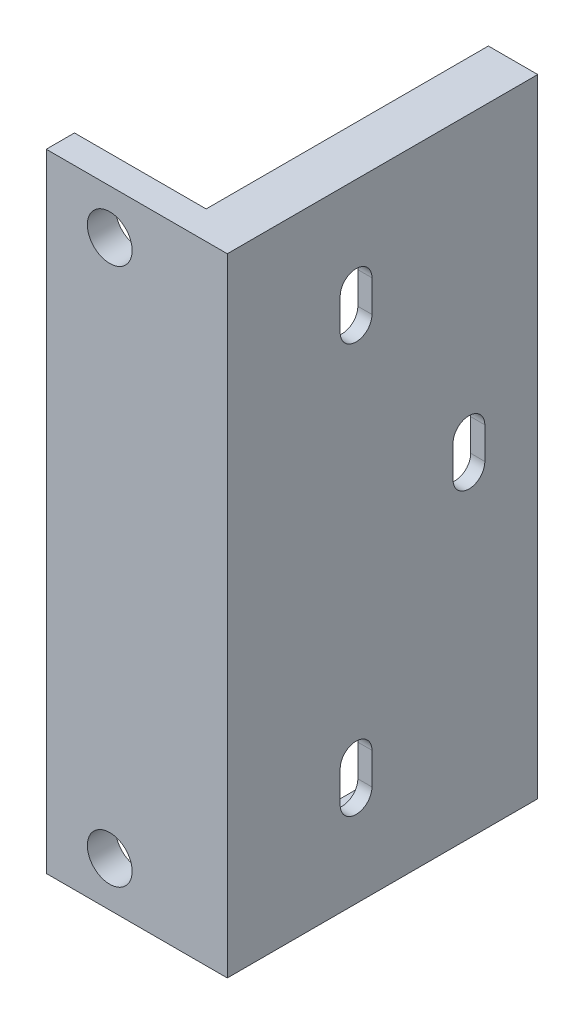
ISO-10303-21;
HEADER;
FILE_DESCRIPTION(('STEP AP214'),'2;1');
FILE_NAME('part.step','',(''),(''),'','','');
FILE_SCHEMA(('AUTOMOTIVE_DESIGN { 1 0 10303 214 1 1 1 1 }'));
ENDSEC;
DATA;
#1=APPLICATION_CONTEXT('core data for automotive mechanical design processes');
#2=APPLICATION_PROTOCOL_DEFINITION('international standard','automotive_design',2000,#1);
#3=PRODUCT_CONTEXT('',#1,'mechanical');
#4=PRODUCT('Part','Part','',(#3));
#5=PRODUCT_RELATED_PRODUCT_CATEGORY('part','',(#4));
#6=PRODUCT_DEFINITION_FORMATION('','',#4);
#7=PRODUCT_DEFINITION_CONTEXT('part definition',#1,'design');
#8=PRODUCT_DEFINITION('design','',#6,#7);
#9=PRODUCT_DEFINITION_SHAPE('','',#8);
#10=(LENGTH_UNIT() NAMED_UNIT(*) SI_UNIT(.MILLI.,.METRE.));
#11=(NAMED_UNIT(*) PLANE_ANGLE_UNIT() SI_UNIT($,.RADIAN.));
#12=(NAMED_UNIT(*) SI_UNIT($,.STERADIAN.) SOLID_ANGLE_UNIT());
#13=UNCERTAINTY_MEASURE_WITH_UNIT(LENGTH_MEASURE(1.E-05),#10,'distance_accuracy_value','');
#14=(GEOMETRIC_REPRESENTATION_CONTEXT(3) GLOBAL_UNCERTAINTY_ASSIGNED_CONTEXT((#13)) GLOBAL_UNIT_ASSIGNED_CONTEXT((#10,
#11,#12)) REPRESENTATION_CONTEXT('',''));
#15=CARTESIAN_POINT('',(0.,0.,0.));
#16=DIRECTION('',(0.,0.,1.));
#17=DIRECTION('',(1.,0.,0.));
#18=AXIS2_PLACEMENT_3D('',#15,#16,#17);
#19=CARTESIAN_POINT('',(0.,0.,-2.));
#20=DIRECTION('',(0.,0.,1.));
#21=DIRECTION('',(1.,0.,0.));
#22=AXIS2_PLACEMENT_3D('',#19,#20,#21);
#23=PLANE('',#22);
#24=CARTESIAN_POINT('',(0.,38.1,-2.));
#25=DIRECTION('',(0.,0.,1.));
#26=DIRECTION('',(1.,0.,0.));
#27=AXIS2_PLACEMENT_3D('',#24,#25,#26);
#28=CIRCLE('',#27,3.175);
#29=CARTESIAN_POINT('',(3.17500000000001,38.1,-2.));
#30=VERTEX_POINT('',#29);
#31=EDGE_CURVE('E525',#30,#30,#28,.F.);
#32=ORIENTED_EDGE('',*,*,#31,.F.);
#33=EDGE_LOOP('',(#32));
#34=FACE_BOUND('',#33,.T.);
#35=CARTESIAN_POINT('',(0.,-38.1,-2.));
#36=DIRECTION('',(0.,0.,1.));
#37=DIRECTION('',(1.,0.,0.));
#38=AXIS2_PLACEMENT_3D('',#35,#36,#37);
#39=CIRCLE('',#38,3.175);
#40=CARTESIAN_POINT('',(3.17500000000001,-38.1,-2.));
#41=VERTEX_POINT('',#40);
#42=EDGE_CURVE('E522',#41,#41,#39,.T.);
#43=ORIENTED_EDGE('',*,*,#42,.T.);
#44=EDGE_LOOP('',(#43));
#45=FACE_BOUND('',#44,.T.);
#46=DIRECTION('',(1.,0.,0.));
#47=VECTOR('',#46,1.);
#48=CARTESIAN_POINT('',(9.66240000000001,37.45,-1.99999999999997));
#49=LINE('',#48,#47);
#50=CARTESIAN_POINT('',(9.66240000000001,37.45,-1.99999999999997));
#51=VERTEX_POINT('',#50);
#52=CARTESIAN_POINT('',(14.6624,37.45,-1.99999999999997));
#53=VERTEX_POINT('',#52);
#54=EDGE_CURVE('E324',#51,#53,#49,.T.);
#55=ORIENTED_EDGE('',*,*,#54,.T.);
#56=DIRECTION('',(0.,1.,0.));
#57=VECTOR('',#56,1.);
#58=CARTESIAN_POINT('',(14.6624,44.45,-2.));
#59=LINE('',#58,#57);
#60=CARTESIAN_POINT('',(14.6624,18.,-2.));
#61=VERTEX_POINT('',#60);
#62=EDGE_CURVE('E441',#61,#53,#59,.T.);
#63=ORIENTED_EDGE('',*,*,#62,.F.);
#64=DIRECTION('',(1.,0.,0.));
#65=VECTOR('',#64,1.);
#66=CARTESIAN_POINT('',(9.6624,18.,-2.));
#67=LINE('',#66,#65);
#68=CARTESIAN_POINT('',(9.6624,18.,-2.));
#69=VERTEX_POINT('',#68);
#70=EDGE_CURVE('E364',#69,#61,#67,.T.);
#71=ORIENTED_EDGE('',*,*,#70,.F.);
#72=DIRECTION('',(0.,1.,0.));
#73=VECTOR('',#72,1.);
#74=CARTESIAN_POINT('',(9.6624,11.,-2.));
#75=LINE('',#74,#73);
#76=CARTESIAN_POINT('',(9.6624,11.,-2.));
#77=VERTEX_POINT('',#76);
#78=EDGE_CURVE('E380',#77,#69,#75,.T.);
#79=ORIENTED_EDGE('',*,*,#78,.F.);
#80=DIRECTION('',(1.,0.,0.));
#81=VECTOR('',#80,1.);
#82=CARTESIAN_POINT('',(9.6624,11.,-2.));
#83=LINE('',#82,#81);
#84=CARTESIAN_POINT('',(14.6624,11.,-2.));
#85=VERTEX_POINT('',#84);
#86=EDGE_CURVE('E361',#77,#85,#83,.T.);
#87=ORIENTED_EDGE('',*,*,#86,.T.);
#88=CARTESIAN_POINT('',(14.6624,-11.,-2.));
#89=VERTEX_POINT('',#88);
#90=EDGE_CURVE('E513',#89,#85,#59,.T.);
#91=ORIENTED_EDGE('',*,*,#90,.F.);
#92=DIRECTION('',(1.,0.,0.));
#93=VECTOR('',#92,1.);
#94=CARTESIAN_POINT('',(9.6624,-11.,-2.));
#95=LINE('',#94,#93);
#96=CARTESIAN_POINT('',(9.6624,-11.,-2.));
#97=VERTEX_POINT('',#96);
#98=EDGE_CURVE('E411',#97,#89,#95,.T.);
#99=ORIENTED_EDGE('',*,*,#98,.F.);
#100=DIRECTION('',(0.,1.,0.));
#101=VECTOR('',#100,1.);
#102=CARTESIAN_POINT('',(9.6624,-11.,-2.));
#103=LINE('',#102,#101);
#104=CARTESIAN_POINT('',(9.6624,-18.,-2.));
#105=VERTEX_POINT('',#104);
#106=EDGE_CURVE('E397',#105,#97,#103,.T.);
#107=ORIENTED_EDGE('',*,*,#106,.F.);
#108=DIRECTION('',(1.,0.,0.));
#109=VECTOR('',#108,1.);
#110=CARTESIAN_POINT('',(9.6624,-18.,-2.));
#111=LINE('',#110,#109);
#112=CARTESIAN_POINT('',(14.6624,-18.,-2.));
#113=VERTEX_POINT('',#112);
#114=EDGE_CURVE('E413',#105,#113,#111,.T.);
#115=ORIENTED_EDGE('',*,*,#114,.T.);
#116=CARTESIAN_POINT('',(14.6624,-37.45,-2.));
#117=VERTEX_POINT('',#116);
#118=EDGE_CURVE('E500',#117,#113,#59,.T.);
#119=ORIENTED_EDGE('',*,*,#118,.F.);
#120=DIRECTION('',(1.,0.,0.));
#121=VECTOR('',#120,1.);
#122=CARTESIAN_POINT('',(9.66239999999999,-37.45,-2.));
#123=LINE('',#122,#121);
#124=CARTESIAN_POINT('',(9.66239999999999,-37.45,-2.));
#125=VERTEX_POINT('',#124);
#126=EDGE_CURVE('E332',#125,#117,#123,.T.);
#127=ORIENTED_EDGE('',*,*,#126,.F.);
#128=DIRECTION('',(0.,1.,0.));
#129=VECTOR('',#128,1.);
#130=CARTESIAN_POINT('',(9.66239999999999,-44.45,-2.));
#131=LINE('',#130,#129);
#132=CARTESIAN_POINT('',(9.66239999999999,-44.45,-2.));
#133=VERTEX_POINT('',#132);
#134=EDGE_CURVE('E353',#133,#125,#131,.T.);
#135=ORIENTED_EDGE('',*,*,#134,.F.);
#136=DIRECTION('',(1.,0.,0.));
#137=VECTOR('',#136,1.);
#138=CARTESIAN_POINT('',(0.,-44.45,-2.));
#139=LINE('',#138,#137);
#140=CARTESIAN_POINT('',(-8.99999999999998,-44.45,-2.));
#141=VERTEX_POINT('',#140);
#142=EDGE_CURVE('E519',#141,#133,#139,.T.);
#143=ORIENTED_EDGE('',*,*,#142,.F.);
#144=DIRECTION('',(0.,-1.,0.));
#145=VECTOR('',#144,1.);
#146=CARTESIAN_POINT('',(-8.99999999999998,0.,-2.));
#147=LINE('',#146,#145);
#148=CARTESIAN_POINT('',(-8.99999999999999,44.45,-2.));
#149=VERTEX_POINT('',#148);
#150=EDGE_CURVE('E516',#149,#141,#147,.T.);
#151=ORIENTED_EDGE('',*,*,#150,.F.);
#152=DIRECTION('',(1.,0.,0.));
#153=VECTOR('',#152,1.);
#154=CARTESIAN_POINT('',(0.,44.45,-2.));
#155=LINE('',#154,#153);
#156=CARTESIAN_POINT('',(9.66240000000001,44.45,-1.99999999999997));
#157=VERTEX_POINT('',#156);
#158=EDGE_CURVE('E511',#149,#157,#155,.T.);
#159=ORIENTED_EDGE('',*,*,#158,.T.);
#160=DIRECTION('',(0.,1.,0.));
#161=VECTOR('',#160,1.);
#162=CARTESIAN_POINT('',(9.66240000000001,44.45,-1.99999999999997));
#163=LINE('',#162,#161);
#164=EDGE_CURVE('E337',#51,#157,#163,.T.);
#165=ORIENTED_EDGE('',*,*,#164,.F.);
#166=EDGE_LOOP('',(#55,#63,#71,#79,#87,#91,#99,#107,#115,#119,#127,#135,#143,#151,#159,#165));
#167=FACE_BOUND('',#166,.T.);
#168=ADVANCED_FACE('F53',(#34,#45,#167),#23,.F.);
#169=CARTESIAN_POINT('',(14.6624,44.45,-42.));
#170=DIRECTION('',(1.,0.,0.));
#171=DIRECTION('',(0.,1.,0.));
#172=AXIS2_PLACEMENT_3D('',#169,#170,#171);
#173=PLANE('',#172);
#174=DIRECTION('',(0.,-1.,0.));
#175=VECTOR('',#174,1.);
#176=CARTESIAN_POINT('',(14.6624,44.45,-14.));
#177=LINE('',#176,#175);
#178=CARTESIAN_POINT('',(14.6624,31.25,-14.));
#179=VERTEX_POINT('',#178);
#180=CARTESIAN_POINT('',(14.6624,26.75,-14.));
#181=VERTEX_POINT('',#180);
#182=EDGE_CURVE('E62',#179,#181,#177,.T.);
#183=ORIENTED_EDGE('',*,*,#182,.T.);
#184=CARTESIAN_POINT('',(14.6624,26.75,-16.25));
#185=DIRECTION('',(1.,0.,0.));
#186=DIRECTION('',(0.,1.,0.));
#187=AXIS2_PLACEMENT_3D('',#184,#185,#186);
#188=CIRCLE('',#187,2.25);
#189=CARTESIAN_POINT('',(14.6624,26.75,-18.5));
#190=VERTEX_POINT('',#189);
#191=EDGE_CURVE('E11',#181,#190,#188,.T.);
#192=ORIENTED_EDGE('',*,*,#191,.T.);
#193=DIRECTION('',(0.,1.,0.));
#194=VECTOR('',#193,1.);
#195=CARTESIAN_POINT('',(14.6624,44.45,-18.5));
#196=LINE('',#195,#194);
#197=CARTESIAN_POINT('',(14.6624,31.25,-18.5));
#198=VERTEX_POINT('',#197);
#199=EDGE_CURVE('E561',#190,#198,#196,.T.);
#200=ORIENTED_EDGE('',*,*,#199,.T.);
#201=CARTESIAN_POINT('',(14.6624,31.25,-16.25));
#202=DIRECTION('',(1.,0.,0.));
#203=DIRECTION('',(0.,1.,0.));
#204=AXIS2_PLACEMENT_3D('',#201,#202,#203);
#205=CIRCLE('',#204,2.25);
#206=EDGE_CURVE('E565',#198,#179,#205,.T.);
#207=ORIENTED_EDGE('',*,*,#206,.T.);
#208=EDGE_LOOP('',(#183,#192,#200,#207));
#209=FACE_BOUND('',#208,.T.);
#210=DIRECTION('',(0.,0.,1.));
#211=VECTOR('',#210,1.);
#212=CARTESIAN_POINT('',(14.6624,37.45,-42.));
#213=LINE('',#212,#211);
#214=CARTESIAN_POINT('',(14.6624,37.45,-42.));
#215=VERTEX_POINT('',#214);
#216=EDGE_CURVE('E329',#215,#53,#213,.T.);
#217=ORIENTED_EDGE('',*,*,#216,.F.);
#218=DIRECTION('',(0.,1.,0.));
#219=VECTOR('',#218,1.);
#220=CARTESIAN_POINT('',(14.6624,44.45,-42.));
#221=LINE('',#220,#219);
#222=CARTESIAN_POINT('',(14.6624,18.,-42.));
#223=VERTEX_POINT('',#222);
#224=EDGE_CURVE('E502',#223,#215,#221,.T.);
#225=ORIENTED_EDGE('',*,*,#224,.F.);
#226=DIRECTION('',(0.,0.,-1.));
#227=VECTOR('',#226,1.);
#228=CARTESIAN_POINT('',(14.6624,18.,-42.));
#229=LINE('',#228,#227);
#230=EDGE_CURVE('E370',#61,#223,#229,.T.);
#231=ORIENTED_EDGE('',*,*,#230,.F.);
#232=ORIENTED_EDGE('',*,*,#62,.T.);
#233=EDGE_LOOP('',(#217,#225,#231,#232));
#234=FACE_BOUND('',#233,.T.);
#235=ADVANCED_FACE('F571',(#209,#234),#173,.F.);
#236=DIRECTION('',(0.,1.,0.));
#237=VECTOR('',#236,1.);
#238=CARTESIAN_POINT('',(14.6624,44.45,-18.5));
#239=LINE('',#238,#237);
#240=CARTESIAN_POINT('',(14.6624,-31.25,-18.5));
#241=VERTEX_POINT('',#240);
#242=CARTESIAN_POINT('',(14.6624,-26.75,-18.5));
#243=VERTEX_POINT('',#242);
#244=EDGE_CURVE('E539',#241,#243,#239,.T.);
#245=ORIENTED_EDGE('',*,*,#244,.T.);
#246=CARTESIAN_POINT('',(14.6624,-26.75,-16.25));
#247=DIRECTION('',(1.,0.,0.));
#248=DIRECTION('',(0.,1.,0.));
#249=AXIS2_PLACEMENT_3D('',#246,#247,#248);
#250=CIRCLE('',#249,2.25);
#251=CARTESIAN_POINT('',(14.6624,-26.75,-14.));
#252=VERTEX_POINT('',#251);
#253=EDGE_CURVE('E542',#243,#252,#250,.T.);
#254=ORIENTED_EDGE('',*,*,#253,.T.);
#255=DIRECTION('',(0.,-1.,0.));
#256=VECTOR('',#255,1.);
#257=CARTESIAN_POINT('',(14.6624,44.45,-14.));
#258=LINE('',#257,#256);
#259=CARTESIAN_POINT('',(14.6624,-31.25,-14.));
#260=VERTEX_POINT('',#259);
#261=EDGE_CURVE('E295',#252,#260,#258,.T.);
#262=ORIENTED_EDGE('',*,*,#261,.T.);
#263=CARTESIAN_POINT('',(14.6624,-31.25,-16.25));
#264=DIRECTION('',(1.,0.,0.));
#265=DIRECTION('',(0.,1.,0.));
#266=AXIS2_PLACEMENT_3D('',#263,#264,#265);
#267=CIRCLE('',#266,2.25);
#268=EDGE_CURVE('E536',#260,#241,#267,.T.);
#269=ORIENTED_EDGE('',*,*,#268,.T.);
#270=EDGE_LOOP('',(#245,#254,#262,#269));
#271=FACE_BOUND('',#270,.T.);
#272=DIRECTION('',(0.,0.,-1.));
#273=VECTOR('',#272,1.);
#274=CARTESIAN_POINT('',(14.6624,-37.45,-42.));
#275=LINE('',#274,#273);
#276=CARTESIAN_POINT('',(14.6624,-37.45,-42.));
#277=VERTEX_POINT('',#276);
#278=EDGE_CURVE('E348',#117,#277,#275,.T.);
#279=ORIENTED_EDGE('',*,*,#278,.F.);
#280=ORIENTED_EDGE('',*,*,#118,.T.);
#281=DIRECTION('',(0.,0.,1.));
#282=VECTOR('',#281,1.);
#283=CARTESIAN_POINT('',(14.6624,-18.,-42.));
#284=LINE('',#283,#282);
#285=CARTESIAN_POINT('',(14.6624,-18.,-42.));
#286=VERTEX_POINT('',#285);
#287=EDGE_CURVE('E377',#286,#113,#284,.T.);
#288=ORIENTED_EDGE('',*,*,#287,.F.);
#289=EDGE_CURVE('E503',#277,#286,#221,.T.);
#290=ORIENTED_EDGE('',*,*,#289,.F.);
#291=EDGE_LOOP('',(#279,#280,#288,#290));
#292=FACE_BOUND('',#291,.T.);
#293=ADVANCED_FACE('F608',(#271,#292),#173,.F.);
#294=DIRECTION('',(0.,1.,0.));
#295=VECTOR('',#294,1.);
#296=CARTESIAN_POINT('',(14.6624,44.45,-34.5));
#297=LINE('',#296,#295);
#298=CARTESIAN_POINT('',(14.6624,0.699999999999994,-34.5));
#299=VERTEX_POINT('',#298);
#300=CARTESIAN_POINT('',(14.6624,5.2,-34.5));
#301=VERTEX_POINT('',#300);
#302=EDGE_CURVE('E553',#299,#301,#297,.T.);
#303=ORIENTED_EDGE('',*,*,#302,.T.);
#304=CARTESIAN_POINT('',(14.6624,5.2,-32.25));
#305=DIRECTION('',(1.,0.,0.));
#306=DIRECTION('',(0.,1.,0.));
#307=AXIS2_PLACEMENT_3D('',#304,#305,#306);
#308=CIRCLE('',#307,2.25);
#309=CARTESIAN_POINT('',(14.6624,5.19999999999998,-30.));
#310=VERTEX_POINT('',#309);
#311=EDGE_CURVE('E557',#301,#310,#308,.T.);
#312=ORIENTED_EDGE('',*,*,#311,.T.);
#313=DIRECTION('',(0.,-1.,0.));
#314=VECTOR('',#313,1.);
#315=CARTESIAN_POINT('',(14.6624,44.45,-30.));
#316=LINE('',#315,#314);
#317=CARTESIAN_POINT('',(14.6624,0.699999999999978,-30.));
#318=VERTEX_POINT('',#317);
#319=EDGE_CURVE('E545',#310,#318,#316,.T.);
#320=ORIENTED_EDGE('',*,*,#319,.T.);
#321=CARTESIAN_POINT('',(14.6624,0.699999999999994,-32.25));
#322=DIRECTION('',(1.,0.,0.));
#323=DIRECTION('',(0.,1.,0.));
#324=AXIS2_PLACEMENT_3D('',#321,#322,#323);
#325=CIRCLE('',#324,2.25);
#326=EDGE_CURVE('E549',#318,#299,#325,.T.);
#327=ORIENTED_EDGE('',*,*,#326,.T.);
#328=EDGE_LOOP('',(#303,#312,#320,#327));
#329=FACE_BOUND('',#328,.T.);
#330=DIRECTION('',(0.,0.,1.));
#331=VECTOR('',#330,1.);
#332=CARTESIAN_POINT('',(14.6624,11.,-42.));
#333=LINE('',#332,#331);
#334=CARTESIAN_POINT('',(14.6624,11.,-42.));
#335=VERTEX_POINT('',#334);
#336=EDGE_CURVE('E373',#335,#85,#333,.T.);
#337=ORIENTED_EDGE('',*,*,#336,.F.);
#338=CARTESIAN_POINT('',(14.6624,-11.,-42.));
#339=VERTEX_POINT('',#338);
#340=EDGE_CURVE('E507',#339,#335,#221,.T.);
#341=ORIENTED_EDGE('',*,*,#340,.F.);
#342=DIRECTION('',(0.,0.,-1.));
#343=VECTOR('',#342,1.);
#344=CARTESIAN_POINT('',(14.6624,-11.,-42.));
#345=LINE('',#344,#343);
#346=EDGE_CURVE('E394',#89,#339,#345,.T.);
#347=ORIENTED_EDGE('',*,*,#346,.F.);
#348=ORIENTED_EDGE('',*,*,#90,.T.);
#349=EDGE_LOOP('',(#337,#341,#347,#348));
#350=FACE_BOUND('',#349,.T.);
#351=ADVANCED_FACE('F610',(#329,#350),#173,.F.);
#352=CARTESIAN_POINT('',(16.6624,0.,-2.));
#353=DIRECTION('',(-1.,0.,0.));
#354=DIRECTION('',(0.,-1.,0.));
#355=AXIS2_PLACEMENT_3D('',#352,#353,#354);
#356=PLANE('',#355);
#357=DIRECTION('',(0.,1.,0.));
#358=VECTOR('',#357,1.);
#359=CARTESIAN_POINT('',(16.6624,-44.45,2.));
#360=LINE('',#359,#358);
#361=CARTESIAN_POINT('',(16.6624,-44.45,2.));
#362=VERTEX_POINT('',#361);
#363=CARTESIAN_POINT('',(16.6624,44.45,2.));
#364=VERTEX_POINT('',#363);
#365=EDGE_CURVE('E299',#362,#364,#360,.T.);
#366=ORIENTED_EDGE('',*,*,#365,.F.);
#367=DIRECTION('',(0.,0.,1.));
#368=VECTOR('',#367,1.);
#369=CARTESIAN_POINT('',(16.6624,-44.45,-2.));
#370=LINE('',#369,#368);
#371=CARTESIAN_POINT('',(16.6624,-44.45,-42.));
#372=VERTEX_POINT('',#371);
#373=EDGE_CURVE('E285',#372,#362,#370,.T.);
#374=ORIENTED_EDGE('',*,*,#373,.F.);
#375=DIRECTION('',(0.,-1.,0.));
#376=VECTOR('',#375,1.);
#377=CARTESIAN_POINT('',(16.6624,44.45,-42.));
#378=LINE('',#377,#376);
#379=CARTESIAN_POINT('',(16.6624,44.45,-42.));
#380=VERTEX_POINT('',#379);
#381=EDGE_CURVE('E497',#380,#372,#378,.T.);
#382=ORIENTED_EDGE('',*,*,#381,.F.);
#383=DIRECTION('',(0.,0.,1.));
#384=VECTOR('',#383,1.);
#385=CARTESIAN_POINT('',(16.6624,44.45,-2.));
#386=LINE('',#385,#384);
#387=EDGE_CURVE('E301',#380,#364,#386,.T.);
#388=ORIENTED_EDGE('',*,*,#387,.T.);
#389=EDGE_LOOP('',(#366,#374,#382,#388));
#390=FACE_BOUND('',#389,.T.);
#391=DIRECTION('',(0.,-1.,0.));
#392=VECTOR('',#391,1.);
#393=CARTESIAN_POINT('',(16.6624,-26.75,-14.));
#394=LINE('',#393,#392);
#395=CARTESIAN_POINT('',(16.6624,-26.75,-14.));
#396=VERTEX_POINT('',#395);
#397=CARTESIAN_POINT('',(16.6624,-31.25,-14.));
#398=VERTEX_POINT('',#397);
#399=EDGE_CURVE('E493',#396,#398,#394,.T.);
#400=ORIENTED_EDGE('',*,*,#399,.F.);
#401=CARTESIAN_POINT('',(16.6624,-26.75,-16.25));
#402=DIRECTION('',(1.,0.,0.));
#403=DIRECTION('',(0.,1.,0.));
#404=AXIS2_PLACEMENT_3D('',#401,#402,#403);
#405=CIRCLE('',#404,2.25);
#406=CARTESIAN_POINT('',(16.6624,-26.75,-18.5));
#407=VERTEX_POINT('',#406);
#408=EDGE_CURVE('E465',#407,#396,#405,.T.);
#409=ORIENTED_EDGE('',*,*,#408,.F.);
#410=DIRECTION('',(0.,1.,0.));
#411=VECTOR('',#410,1.);
#412=CARTESIAN_POINT('',(16.6624,-26.75,-18.5));
#413=LINE('',#412,#411);
#414=CARTESIAN_POINT('',(16.6624,-31.25,-18.5));
#415=VERTEX_POINT('',#414);
#416=EDGE_CURVE('E482',#415,#407,#413,.T.);
#417=ORIENTED_EDGE('',*,*,#416,.F.);
#418=CARTESIAN_POINT('',(16.6624,-31.25,-16.25));
#419=DIRECTION('',(1.,0.,0.));
#420=DIRECTION('',(0.,1.,0.));
#421=AXIS2_PLACEMENT_3D('',#418,#419,#420);
#422=CIRCLE('',#421,2.25);
#423=EDGE_CURVE('E490',#398,#415,#422,.T.);
#424=ORIENTED_EDGE('',*,*,#423,.F.);
#425=EDGE_LOOP('',(#400,#409,#417,#424));
#426=FACE_BOUND('',#425,.T.);
#427=DIRECTION('',(0.,-1.,0.));
#428=VECTOR('',#427,1.);
#429=CARTESIAN_POINT('',(16.6624,5.19999999999998,-30.));
#430=LINE('',#429,#428);
#431=CARTESIAN_POINT('',(16.6624,5.19999999999998,-30.));
#432=VERTEX_POINT('',#431);
#433=CARTESIAN_POINT('',(16.6624,0.699999999999978,-30.));
#434=VERTEX_POINT('',#433);
#435=EDGE_CURVE('E473',#432,#434,#430,.T.);
#436=ORIENTED_EDGE('',*,*,#435,.F.);
#437=CARTESIAN_POINT('',(16.6624,5.2,-32.25));
#438=DIRECTION('',(1.,0.,0.));
#439=DIRECTION('',(0.,1.,0.));
#440=AXIS2_PLACEMENT_3D('',#437,#438,#439);
#441=CIRCLE('',#440,2.25);
#442=CARTESIAN_POINT('',(16.6624,5.2,-34.5));
#443=VERTEX_POINT('',#442);
#444=EDGE_CURVE('E425',#443,#432,#441,.T.);
#445=ORIENTED_EDGE('',*,*,#444,.F.);
#446=DIRECTION('',(0.,1.,0.));
#447=VECTOR('',#446,1.);
#448=CARTESIAN_POINT('',(16.6624,5.2,-34.5));
#449=LINE('',#448,#447);
#450=CARTESIAN_POINT('',(16.6624,0.699999999999994,-34.5));
#451=VERTEX_POINT('',#450);
#452=EDGE_CURVE('E455',#451,#443,#449,.T.);
#453=ORIENTED_EDGE('',*,*,#452,.F.);
#454=CARTESIAN_POINT('',(16.6624,0.699999999999994,-32.25));
#455=DIRECTION('',(1.,0.,0.));
#456=DIRECTION('',(0.,1.,0.));
#457=AXIS2_PLACEMENT_3D('',#454,#455,#456);
#458=CIRCLE('',#457,2.25);
#459=EDGE_CURVE('E469',#434,#451,#458,.T.);
#460=ORIENTED_EDGE('',*,*,#459,.F.);
#461=EDGE_LOOP('',(#436,#445,#453,#460));
#462=FACE_BOUND('',#461,.T.);
#463=DIRECTION('',(0.,1.,0.));
#464=VECTOR('',#463,1.);
#465=CARTESIAN_POINT('',(16.6624,26.75,-18.5));
#466=LINE('',#465,#464);
#467=CARTESIAN_POINT('',(16.6624,26.75,-18.5));
#468=VERTEX_POINT('',#467);
#469=CARTESIAN_POINT('',(16.6624,31.25,-18.5));
#470=VERTEX_POINT('',#469);
#471=EDGE_CURVE('E424',#468,#470,#466,.T.);
#472=ORIENTED_EDGE('',*,*,#471,.F.);
#473=CARTESIAN_POINT('',(16.6624,26.75,-16.25));
#474=DIRECTION('',(1.,0.,0.));
#475=DIRECTION('',(0.,-1.,0.));
#476=AXIS2_PLACEMENT_3D('',#473,#474,#475);
#477=CIRCLE('',#476,2.25);
#478=CARTESIAN_POINT('',(16.6624,26.75,-14.));
#479=VERTEX_POINT('',#478);
#480=EDGE_CURVE('E421',#479,#468,#477,.T.);
#481=ORIENTED_EDGE('',*,*,#480,.F.);
#482=DIRECTION('',(0.,-1.,0.));
#483=VECTOR('',#482,1.);
#484=CARTESIAN_POINT('',(16.6624,26.75,-14.));
#485=LINE('',#484,#483);
#486=CARTESIAN_POINT('',(16.6624,31.25,-14.));
#487=VERTEX_POINT('',#486);
#488=EDGE_CURVE('E433',#487,#479,#485,.T.);
#489=ORIENTED_EDGE('',*,*,#488,.F.);
#490=CARTESIAN_POINT('',(16.6624,31.25,-16.25));
#491=DIRECTION('',(1.,0.,0.));
#492=DIRECTION('',(0.,-1.,0.));
#493=AXIS2_PLACEMENT_3D('',#490,#491,#492);
#494=CIRCLE('',#493,2.25);
#495=EDGE_CURVE('E429',#470,#487,#494,.T.);
#496=ORIENTED_EDGE('',*,*,#495,.F.);
#497=EDGE_LOOP('',(#472,#481,#489,#496));
#498=FACE_BOUND('',#497,.T.);
#499=ADVANCED_FACE('F55',(#390,#426,#462,#498),#356,.F.);
#500=CARTESIAN_POINT('',(0.,-44.45,-2.));
#501=DIRECTION('',(0.,-1.,0.));
#502=DIRECTION('',(1.,0.,0.));
#503=AXIS2_PLACEMENT_3D('',#500,#501,#502);
#504=PLANE('',#503);
#505=DIRECTION('',(1.,0.,0.));
#506=VECTOR('',#505,1.);
#507=CARTESIAN_POINT('',(-8.99999999999998,-44.45,2.));
#508=LINE('',#507,#506);
#509=CARTESIAN_POINT('',(-8.99999999999998,-44.45,2.));
#510=VERTEX_POINT('',#509);
#511=EDGE_CURVE('E289',#510,#362,#508,.T.);
#512=ORIENTED_EDGE('',*,*,#511,.F.);
#513=DIRECTION('',(0.,0.,1.));
#514=VECTOR('',#513,1.);
#515=CARTESIAN_POINT('',(-8.99999999999998,-44.45,-2.));
#516=LINE('',#515,#514);
#517=EDGE_CURVE('E296',#141,#510,#516,.T.);
#518=ORIENTED_EDGE('',*,*,#517,.F.);
#519=ORIENTED_EDGE('',*,*,#142,.T.);
#520=DIRECTION('',(0.,0.,1.));
#521=VECTOR('',#520,1.);
#522=CARTESIAN_POINT('',(9.66239999999999,-44.45,-42.));
#523=LINE('',#522,#521);
#524=CARTESIAN_POINT('',(9.66239999999999,-44.45,-42.));
#525=VERTEX_POINT('',#524);
#526=EDGE_CURVE('E355',#525,#133,#523,.T.);
#527=ORIENTED_EDGE('',*,*,#526,.F.);
#528=DIRECTION('',(-1.,0.,0.));
#529=VECTOR('',#528,1.);
#530=CARTESIAN_POINT('',(16.6624,-44.45,-42.));
#531=LINE('',#530,#529);
#532=EDGE_CURVE('E291',#372,#525,#531,.T.);
#533=ORIENTED_EDGE('',*,*,#532,.F.);
#534=ORIENTED_EDGE('',*,*,#373,.T.);
#535=EDGE_LOOP('',(#512,#518,#519,#527,#533,#534));
#536=FACE_BOUND('',#535,.T.);
#537=ADVANCED_FACE('F287',(#536),#504,.T.);
#538=CARTESIAN_POINT('',(-8.99999999999998,0.,-2.));
#539=DIRECTION('',(-1.,0.,0.));
#540=DIRECTION('',(0.,-1.,0.));
#541=AXIS2_PLACEMENT_3D('',#538,#539,#540);
#542=PLANE('',#541);
#543=DIRECTION('',(0.,-1.,0.));
#544=VECTOR('',#543,1.);
#545=CARTESIAN_POINT('',(-8.99999999999999,44.45,2.));
#546=LINE('',#545,#544);
#547=CARTESIAN_POINT('',(-8.99999999999999,44.45,2.));
#548=VERTEX_POINT('',#547);
#549=EDGE_CURVE('E311',#548,#510,#546,.T.);
#550=ORIENTED_EDGE('',*,*,#549,.F.);
#551=DIRECTION('',(0.,0.,1.));
#552=VECTOR('',#551,1.);
#553=CARTESIAN_POINT('',(-8.99999999999999,44.45,-2.));
#554=LINE('',#553,#552);
#555=EDGE_CURVE('E530',#149,#548,#554,.T.);
#556=ORIENTED_EDGE('',*,*,#555,.F.);
#557=ORIENTED_EDGE('',*,*,#150,.T.);
#558=ORIENTED_EDGE('',*,*,#517,.T.);
#559=EDGE_LOOP('',(#550,#556,#557,#558));
#560=FACE_BOUND('',#559,.T.);
#561=ADVANCED_FACE('F624',(#560),#542,.T.);
#562=CARTESIAN_POINT('',(0.,-38.1,-2.));
#563=DIRECTION('',(0.,0.,1.));
#564=DIRECTION('',(1.,0.,0.));
#565=AXIS2_PLACEMENT_3D('',#562,#563,#564);
#566=CYLINDRICAL_SURFACE('',#565,3.175);
#567=CARTESIAN_POINT('',(0.,-38.1,2.));
#568=DIRECTION('',(0.,0.,1.));
#569=DIRECTION('',(1.,0.,0.));
#570=AXIS2_PLACEMENT_3D('',#567,#568,#569);
#571=CIRCLE('',#570,3.175);
#572=CARTESIAN_POINT('',(3.17500000000001,-38.1,2.));
#573=VERTEX_POINT('',#572);
#574=EDGE_CURVE('E312',#573,#573,#571,.T.);
#575=ORIENTED_EDGE('',*,*,#574,.T.);
#576=EDGE_LOOP('',(#575));
#577=FACE_BOUND('',#576,.T.);
#578=ORIENTED_EDGE('',*,*,#42,.F.);
#579=EDGE_LOOP('',(#578));
#580=FACE_BOUND('',#579,.T.);
#581=ADVANCED_FACE('F621',(#577,#580),#566,.F.);
#582=CARTESIAN_POINT('',(0.,44.45,-2.));
#583=DIRECTION('',(0.,-1.,0.));
#584=DIRECTION('',(1.,0.,0.));
#585=AXIS2_PLACEMENT_3D('',#582,#583,#584);
#586=PLANE('',#585);
#587=DIRECTION('',(-1.,0.,0.));
#588=VECTOR('',#587,1.);
#589=CARTESIAN_POINT('',(16.6624,44.45,2.));
#590=LINE('',#589,#588);
#591=EDGE_CURVE('E305',#364,#548,#590,.T.);
#592=ORIENTED_EDGE('',*,*,#591,.F.);
#593=ORIENTED_EDGE('',*,*,#387,.F.);
#594=DIRECTION('',(1.,0.,0.));
#595=VECTOR('',#594,1.);
#596=CARTESIAN_POINT('',(16.6624,44.45,-42.));
#597=LINE('',#596,#595);
#598=CARTESIAN_POINT('',(9.66240000000001,44.45,-42.));
#599=VERTEX_POINT('',#598);
#600=EDGE_CURVE('E506',#599,#380,#597,.T.);
#601=ORIENTED_EDGE('',*,*,#600,.F.);
#602=DIRECTION('',(0.,0.,-1.));
#603=VECTOR('',#602,1.);
#604=CARTESIAN_POINT('',(9.66240000000001,44.45,-42.));
#605=LINE('',#604,#603);
#606=EDGE_CURVE('E328',#157,#599,#605,.T.);
#607=ORIENTED_EDGE('',*,*,#606,.F.);
#608=ORIENTED_EDGE('',*,*,#158,.F.);
#609=ORIENTED_EDGE('',*,*,#555,.T.);
#610=EDGE_LOOP('',(#592,#593,#601,#607,#608,#609));
#611=FACE_BOUND('',#610,.T.);
#612=ADVANCED_FACE('F619',(#611),#586,.F.);
#613=CARTESIAN_POINT('',(0.,38.1,-2.));
#614=DIRECTION('',(0.,0.,1.));
#615=DIRECTION('',(1.,0.,0.));
#616=AXIS2_PLACEMENT_3D('',#613,#614,#615);
#617=CYLINDRICAL_SURFACE('',#616,3.175);
#618=CARTESIAN_POINT('',(0.,38.1,2.));
#619=DIRECTION('',(0.,0.,1.));
#620=DIRECTION('',(1.,0.,0.));
#621=AXIS2_PLACEMENT_3D('',#618,#619,#620);
#622=CIRCLE('',#621,3.175);
#623=CARTESIAN_POINT('',(3.17500000000001,38.1,2.));
#624=VERTEX_POINT('',#623);
#625=EDGE_CURVE('E315',#624,#624,#622,.T.);
#626=ORIENTED_EDGE('',*,*,#625,.T.);
#627=EDGE_LOOP('',(#626));
#628=FACE_BOUND('',#627,.T.);
#629=ORIENTED_EDGE('',*,*,#31,.T.);
#630=EDGE_LOOP('',(#629));
#631=FACE_BOUND('',#630,.T.);
#632=ADVANCED_FACE('F615',(#628,#631),#617,.F.);
#633=CARTESIAN_POINT('',(0.,0.,-42.));
#634=DIRECTION('',(0.,0.,-1.));
#635=DIRECTION('',(-1.,0.,0.));
#636=AXIS2_PLACEMENT_3D('',#633,#634,#635);
#637=PLANE('',#636);
#638=ORIENTED_EDGE('',*,*,#381,.T.);
#639=ORIENTED_EDGE('',*,*,#532,.T.);
#640=DIRECTION('',(0.,-1.,0.));
#641=VECTOR('',#640,1.);
#642=CARTESIAN_POINT('',(9.66239999999999,-44.45,-42.));
#643=LINE('',#642,#641);
#644=CARTESIAN_POINT('',(9.66239999999999,-37.45,-42.));
#645=VERTEX_POINT('',#644);
#646=EDGE_CURVE('E351',#645,#525,#643,.T.);
#647=ORIENTED_EDGE('',*,*,#646,.F.);
#648=DIRECTION('',(1.,0.,0.));
#649=VECTOR('',#648,1.);
#650=CARTESIAN_POINT('',(9.66239999999999,-37.45,-42.));
#651=LINE('',#650,#649);
#652=EDGE_CURVE('E69',#645,#277,#651,.T.);
#653=ORIENTED_EDGE('',*,*,#652,.T.);
#654=ORIENTED_EDGE('',*,*,#289,.T.);
#655=DIRECTION('',(1.,0.,0.));
#656=VECTOR('',#655,1.);
#657=CARTESIAN_POINT('',(9.6624,-18.,-42.));
#658=LINE('',#657,#656);
#659=CARTESIAN_POINT('',(9.6624,-18.,-42.));
#660=VERTEX_POINT('',#659);
#661=EDGE_CURVE('E416',#660,#286,#658,.T.);
#662=ORIENTED_EDGE('',*,*,#661,.F.);
#663=DIRECTION('',(0.,-1.,0.));
#664=VECTOR('',#663,1.);
#665=CARTESIAN_POINT('',(9.6624,-11.,-42.));
#666=LINE('',#665,#664);
#667=CARTESIAN_POINT('',(9.6624,-11.,-42.));
#668=VERTEX_POINT('',#667);
#669=EDGE_CURVE('E389',#668,#660,#666,.T.);
#670=ORIENTED_EDGE('',*,*,#669,.F.);
#671=DIRECTION('',(1.,0.,0.));
#672=VECTOR('',#671,1.);
#673=CARTESIAN_POINT('',(9.6624,-11.,-42.));
#674=LINE('',#673,#672);
#675=EDGE_CURVE('E402',#668,#339,#674,.T.);
#676=ORIENTED_EDGE('',*,*,#675,.T.);
#677=ORIENTED_EDGE('',*,*,#340,.T.);
#678=DIRECTION('',(1.,0.,0.));
#679=VECTOR('',#678,1.);
#680=CARTESIAN_POINT('',(9.6624,11.,-42.));
#681=LINE('',#680,#679);
#682=CARTESIAN_POINT('',(9.6624,11.,-42.));
#683=VERTEX_POINT('',#682);
#684=EDGE_CURVE('E350',#683,#335,#681,.T.);
#685=ORIENTED_EDGE('',*,*,#684,.F.);
#686=DIRECTION('',(0.,-1.,0.));
#687=VECTOR('',#686,1.);
#688=CARTESIAN_POINT('',(9.6624,11.,-42.));
#689=LINE('',#688,#687);
#690=CARTESIAN_POINT('',(9.6624,18.,-42.));
#691=VERTEX_POINT('',#690);
#692=EDGE_CURVE('E374',#691,#683,#689,.T.);
#693=ORIENTED_EDGE('',*,*,#692,.F.);
#694=DIRECTION('',(1.,0.,0.));
#695=VECTOR('',#694,1.);
#696=CARTESIAN_POINT('',(9.6624,18.,-42.));
#697=LINE('',#696,#695);
#698=EDGE_CURVE('E79',#691,#223,#697,.T.);
#699=ORIENTED_EDGE('',*,*,#698,.T.);
#700=ORIENTED_EDGE('',*,*,#224,.T.);
#701=DIRECTION('',(1.,0.,0.));
#702=VECTOR('',#701,1.);
#703=CARTESIAN_POINT('',(9.66240000000001,37.45,-42.));
#704=LINE('',#703,#702);
#705=CARTESIAN_POINT('',(9.66240000000001,37.45,-42.));
#706=VERTEX_POINT('',#705);
#707=EDGE_CURVE('E321',#706,#215,#704,.T.);
#708=ORIENTED_EDGE('',*,*,#707,.F.);
#709=DIRECTION('',(0.,-1.,0.));
#710=VECTOR('',#709,1.);
#711=CARTESIAN_POINT('',(9.66240000000001,44.45,-42.));
#712=LINE('',#711,#710);
#713=EDGE_CURVE('E333',#599,#706,#712,.T.);
#714=ORIENTED_EDGE('',*,*,#713,.F.);
#715=ORIENTED_EDGE('',*,*,#600,.T.);
#716=EDGE_LOOP('',(#638,#639,#647,#653,#654,#662,#670,#676,#677,#685,#693,#699,#700,#708,#714,#715));
#717=FACE_BOUND('',#716,.T.);
#718=ADVANCED_FACE('F618',(#717),#637,.T.);
#719=CARTESIAN_POINT('',(-3.33759999999999,-26.75,-16.25));
#720=DIRECTION('',(1.,0.,0.));
#721=DIRECTION('',(0.,1.,0.));
#722=AXIS2_PLACEMENT_3D('',#719,#720,#721);
#723=CYLINDRICAL_SURFACE('',#722,2.25);
#724=DIRECTION('',(1.,0.,0.));
#725=VECTOR('',#724,1.);
#726=CARTESIAN_POINT('',(-3.33759999999999,-26.75,-18.5));
#727=LINE('',#726,#725);
#728=EDGE_CURVE('E420',#243,#407,#727,.T.);
#729=ORIENTED_EDGE('',*,*,#728,.T.);
#730=ORIENTED_EDGE('',*,*,#408,.T.);
#731=DIRECTION('',(1.,0.,0.));
#732=VECTOR('',#731,1.);
#733=CARTESIAN_POINT('',(-3.33759999999999,-26.75,-14.));
#734=LINE('',#733,#732);
#735=EDGE_CURVE('E479',#252,#396,#734,.T.);
#736=ORIENTED_EDGE('',*,*,#735,.F.);
#737=ORIENTED_EDGE('',*,*,#253,.F.);
#738=EDGE_LOOP('',(#729,#730,#736,#737));
#739=FACE_BOUND('',#738,.T.);
#740=ADVANCED_FACE('F735',(#739),#723,.F.);
#741=CARTESIAN_POINT('',(-3.33759999999999,-26.75,-18.5));
#742=DIRECTION('',(0.,0.,-1.));
#743=DIRECTION('',(-1.,0.,0.));
#744=AXIS2_PLACEMENT_3D('',#741,#742,#743);
#745=PLANE('',#744);
#746=DIRECTION('',(1.,0.,0.));
#747=VECTOR('',#746,1.);
#748=CARTESIAN_POINT('',(-3.33759999999999,-31.25,-18.5));
#749=LINE('',#748,#747);
#750=EDGE_CURVE('E485',#241,#415,#749,.T.);
#751=ORIENTED_EDGE('',*,*,#750,.T.);
#752=ORIENTED_EDGE('',*,*,#416,.T.);
#753=ORIENTED_EDGE('',*,*,#728,.F.);
#754=ORIENTED_EDGE('',*,*,#244,.F.);
#755=EDGE_LOOP('',(#751,#752,#753,#754));
#756=FACE_BOUND('',#755,.T.);
#757=ADVANCED_FACE('F738',(#756),#745,.F.);
#758=CARTESIAN_POINT('',(-3.33759999999999,-31.25,-16.25));
#759=DIRECTION('',(1.,0.,0.));
#760=DIRECTION('',(0.,1.,0.));
#761=AXIS2_PLACEMENT_3D('',#758,#759,#760);
#762=CYLINDRICAL_SURFACE('',#761,2.25);
#763=DIRECTION('',(1.,0.,0.));
#764=VECTOR('',#763,1.);
#765=CARTESIAN_POINT('',(-3.33759999999999,-31.25,-14.));
#766=LINE('',#765,#764);
#767=EDGE_CURVE('E483',#260,#398,#766,.T.);
#768=ORIENTED_EDGE('',*,*,#767,.T.);
#769=ORIENTED_EDGE('',*,*,#423,.T.);
#770=ORIENTED_EDGE('',*,*,#750,.F.);
#771=ORIENTED_EDGE('',*,*,#268,.F.);
#772=EDGE_LOOP('',(#768,#769,#770,#771));
#773=FACE_BOUND('',#772,.T.);
#774=ADVANCED_FACE('F742',(#773),#762,.F.);
#775=CARTESIAN_POINT('',(-3.33759999999999,-26.75,-14.));
#776=DIRECTION('',(0.,0.,1.));
#777=DIRECTION('',(1.,0.,0.));
#778=AXIS2_PLACEMENT_3D('',#775,#776,#777);
#779=PLANE('',#778);
#780=ORIENTED_EDGE('',*,*,#735,.T.);
#781=ORIENTED_EDGE('',*,*,#399,.T.);
#782=ORIENTED_EDGE('',*,*,#767,.F.);
#783=ORIENTED_EDGE('',*,*,#261,.F.);
#784=EDGE_LOOP('',(#780,#781,#782,#783));
#785=FACE_BOUND('',#784,.T.);
#786=ADVANCED_FACE('F726',(#785),#779,.F.);
#787=CARTESIAN_POINT('',(-3.33759999999999,5.2,-32.25));
#788=DIRECTION('',(1.,0.,0.));
#789=DIRECTION('',(0.,1.,0.));
#790=AXIS2_PLACEMENT_3D('',#787,#788,#789);
#791=CYLINDRICAL_SURFACE('',#790,2.25);
#792=DIRECTION('',(1.,0.,0.));
#793=VECTOR('',#792,1.);
#794=CARTESIAN_POINT('',(-3.33759999999999,5.2,-34.5));
#795=LINE('',#794,#793);
#796=EDGE_CURVE('E462',#301,#443,#795,.T.);
#797=ORIENTED_EDGE('',*,*,#796,.T.);
#798=ORIENTED_EDGE('',*,*,#444,.T.);
#799=DIRECTION('',(1.,0.,0.));
#800=VECTOR('',#799,1.);
#801=CARTESIAN_POINT('',(-3.33759999999999,5.19999999999998,-30.));
#802=LINE('',#801,#800);
#803=EDGE_CURVE('E451',#310,#432,#802,.T.);
#804=ORIENTED_EDGE('',*,*,#803,.F.);
#805=ORIENTED_EDGE('',*,*,#311,.F.);
#806=EDGE_LOOP('',(#797,#798,#804,#805));
#807=FACE_BOUND('',#806,.T.);
#808=ADVANCED_FACE('F723',(#807),#791,.F.);
#809=CARTESIAN_POINT('',(-3.33759999999999,5.2,-34.5));
#810=DIRECTION('',(0.,0.,-1.));
#811=DIRECTION('',(-1.,0.,0.));
#812=AXIS2_PLACEMENT_3D('',#809,#810,#811);
#813=PLANE('',#812);
#814=DIRECTION('',(1.,0.,0.));
#815=VECTOR('',#814,1.);
#816=CARTESIAN_POINT('',(-3.33759999999999,0.699999999999991,-34.5));
#817=LINE('',#816,#815);
#818=EDGE_CURVE('E459',#299,#451,#817,.T.);
#819=ORIENTED_EDGE('',*,*,#818,.T.);
#820=ORIENTED_EDGE('',*,*,#452,.T.);
#821=ORIENTED_EDGE('',*,*,#796,.F.);
#822=ORIENTED_EDGE('',*,*,#302,.F.);
#823=EDGE_LOOP('',(#819,#820,#821,#822));
#824=FACE_BOUND('',#823,.T.);
#825=ADVANCED_FACE('F725',(#824),#813,.F.);
#826=CARTESIAN_POINT('',(-3.33759999999999,0.699999999999991,-32.25));
#827=DIRECTION('',(1.,0.,0.));
#828=DIRECTION('',(0.,1.,0.));
#829=AXIS2_PLACEMENT_3D('',#826,#827,#828);
#830=CYLINDRICAL_SURFACE('',#829,2.25);
#831=DIRECTION('',(1.,0.,0.));
#832=VECTOR('',#831,1.);
#833=CARTESIAN_POINT('',(-3.33759999999999,0.699999999999976,-30.));
#834=LINE('',#833,#832);
#835=EDGE_CURVE('E456',#318,#434,#834,.T.);
#836=ORIENTED_EDGE('',*,*,#835,.T.);
#837=ORIENTED_EDGE('',*,*,#459,.T.);
#838=ORIENTED_EDGE('',*,*,#818,.F.);
#839=ORIENTED_EDGE('',*,*,#326,.F.);
#840=EDGE_LOOP('',(#836,#837,#838,#839));
#841=FACE_BOUND('',#840,.T.);
#842=ADVANCED_FACE('F719',(#841),#830,.F.);
#843=CARTESIAN_POINT('',(-3.33759999999999,5.19999999999998,-30.));
#844=DIRECTION('',(0.,0.,1.));
#845=DIRECTION('',(1.,0.,0.));
#846=AXIS2_PLACEMENT_3D('',#843,#844,#845);
#847=PLANE('',#846);
#848=ORIENTED_EDGE('',*,*,#803,.T.);
#849=ORIENTED_EDGE('',*,*,#435,.T.);
#850=ORIENTED_EDGE('',*,*,#835,.F.);
#851=ORIENTED_EDGE('',*,*,#319,.F.);
#852=EDGE_LOOP('',(#848,#849,#850,#851));
#853=FACE_BOUND('',#852,.T.);
#854=ADVANCED_FACE('F715',(#853),#847,.F.);
#855=CARTESIAN_POINT('',(-3.3376,26.75,-16.25));
#856=DIRECTION('',(1.,0.,0.));
#857=DIRECTION('',(0.,1.,0.));
#858=AXIS2_PLACEMENT_3D('',#855,#856,#857);
#859=CYLINDRICAL_SURFACE('',#858,2.25);
#860=DIRECTION('',(1.,0.,0.));
#861=VECTOR('',#860,1.);
#862=CARTESIAN_POINT('',(-3.3376,26.75,-14.));
#863=LINE('',#862,#861);
#864=EDGE_CURVE('E438',#181,#479,#863,.T.);
#865=ORIENTED_EDGE('',*,*,#864,.T.);
#866=ORIENTED_EDGE('',*,*,#480,.T.);
#867=DIRECTION('',(1.,0.,0.));
#868=VECTOR('',#867,1.);
#869=CARTESIAN_POINT('',(-3.3376,26.75,-18.5));
#870=LINE('',#869,#868);
#871=EDGE_CURVE('E437',#190,#468,#870,.T.);
#872=ORIENTED_EDGE('',*,*,#871,.F.);
#873=ORIENTED_EDGE('',*,*,#191,.F.);
#874=EDGE_LOOP('',(#865,#866,#872,#873));
#875=FACE_BOUND('',#874,.T.);
#876=ADVANCED_FACE('F587',(#875),#859,.F.);
#877=CARTESIAN_POINT('',(-3.3376,26.75,-14.));
#878=DIRECTION('',(0.,0.,1.));
#879=DIRECTION('',(1.,0.,0.));
#880=AXIS2_PLACEMENT_3D('',#877,#878,#879);
#881=PLANE('',#880);
#882=DIRECTION('',(1.,0.,0.));
#883=VECTOR('',#882,1.);
#884=CARTESIAN_POINT('',(-3.3376,31.25,-14.));
#885=LINE('',#884,#883);
#886=EDGE_CURVE('E442',#179,#487,#885,.T.);
#887=ORIENTED_EDGE('',*,*,#886,.T.);
#888=ORIENTED_EDGE('',*,*,#488,.T.);
#889=ORIENTED_EDGE('',*,*,#864,.F.);
#890=ORIENTED_EDGE('',*,*,#182,.F.);
#891=EDGE_LOOP('',(#887,#888,#889,#890));
#892=FACE_BOUND('',#891,.T.);
#893=ADVANCED_FACE('F577',(#892),#881,.F.);
#894=CARTESIAN_POINT('',(-3.3376,31.25,-16.25));
#895=DIRECTION('',(1.,0.,0.));
#896=DIRECTION('',(0.,1.,0.));
#897=AXIS2_PLACEMENT_3D('',#894,#895,#896);
#898=CYLINDRICAL_SURFACE('',#897,2.25);
#899=DIRECTION('',(1.,0.,0.));
#900=VECTOR('',#899,1.);
#901=CARTESIAN_POINT('',(-3.3376,31.25,-18.5));
#902=LINE('',#901,#900);
#903=EDGE_CURVE('E445',#198,#470,#902,.T.);
#904=ORIENTED_EDGE('',*,*,#903,.T.);
#905=ORIENTED_EDGE('',*,*,#495,.T.);
#906=ORIENTED_EDGE('',*,*,#886,.F.);
#907=ORIENTED_EDGE('',*,*,#206,.F.);
#908=EDGE_LOOP('',(#904,#905,#906,#907));
#909=FACE_BOUND('',#908,.T.);
#910=ADVANCED_FACE('F579',(#909),#898,.F.);
#911=CARTESIAN_POINT('',(-3.3376,26.75,-18.5));
#912=DIRECTION('',(0.,0.,-1.));
#913=DIRECTION('',(-1.,0.,0.));
#914=AXIS2_PLACEMENT_3D('',#911,#912,#913);
#915=PLANE('',#914);
#916=ORIENTED_EDGE('',*,*,#871,.T.);
#917=ORIENTED_EDGE('',*,*,#471,.T.);
#918=ORIENTED_EDGE('',*,*,#903,.F.);
#919=ORIENTED_EDGE('',*,*,#199,.F.);
#920=EDGE_LOOP('',(#916,#917,#918,#919));
#921=FACE_BOUND('',#920,.T.);
#922=ADVANCED_FACE('F589',(#921),#915,.F.);
#923=CARTESIAN_POINT('',(9.6624,-18.,-42.));
#924=DIRECTION('',(0.,1.,0.));
#925=DIRECTION('',(-1.,0.,0.));
#926=AXIS2_PLACEMENT_3D('',#923,#924,#925);
#927=PLANE('',#926);
#928=ORIENTED_EDGE('',*,*,#287,.T.);
#929=ORIENTED_EDGE('',*,*,#114,.F.);
#930=DIRECTION('',(0.,0.,1.));
#931=VECTOR('',#930,1.);
#932=CARTESIAN_POINT('',(9.6624,-18.,-42.));
#933=LINE('',#932,#931);
#934=EDGE_CURVE('E393',#660,#105,#933,.T.);
#935=ORIENTED_EDGE('',*,*,#934,.F.);
#936=ORIENTED_EDGE('',*,*,#661,.T.);
#937=EDGE_LOOP('',(#928,#929,#935,#936));
#938=FACE_BOUND('',#937,.T.);
#939=ADVANCED_FACE('F591',(#938),#927,.F.);
#940=CARTESIAN_POINT('',(9.6624,-11.,-42.));
#941=DIRECTION('',(0.,-1.,0.));
#942=DIRECTION('',(1.,0.,0.));
#943=AXIS2_PLACEMENT_3D('',#940,#941,#942);
#944=PLANE('',#943);
#945=ORIENTED_EDGE('',*,*,#346,.T.);
#946=ORIENTED_EDGE('',*,*,#675,.F.);
#947=DIRECTION('',(0.,0.,-1.));
#948=VECTOR('',#947,1.);
#949=CARTESIAN_POINT('',(9.6624,-11.,-42.));
#950=LINE('',#949,#948);
#951=EDGE_CURVE('E399',#97,#668,#950,.T.);
#952=ORIENTED_EDGE('',*,*,#951,.F.);
#953=ORIENTED_EDGE('',*,*,#98,.T.);
#954=EDGE_LOOP('',(#945,#946,#952,#953));
#955=FACE_BOUND('',#954,.T.);
#956=ADVANCED_FACE('F598',(#955),#944,.F.);
#957=CARTESIAN_POINT('',(9.6624,0.,0.));
#958=DIRECTION('',(-1.,0.,0.));
#959=DIRECTION('',(0.,0.,1.));
#960=AXIS2_PLACEMENT_3D('',#957,#958,#959);
#961=PLANE('',#960);
#962=ORIENTED_EDGE('',*,*,#669,.T.);
#963=ORIENTED_EDGE('',*,*,#934,.T.);
#964=ORIENTED_EDGE('',*,*,#106,.T.);
#965=ORIENTED_EDGE('',*,*,#951,.T.);
#966=EDGE_LOOP('',(#962,#963,#964,#965));
#967=FACE_BOUND('',#966,.T.);
#968=ADVANCED_FACE('F698',(#967),#961,.T.);
#969=CARTESIAN_POINT('',(9.6624,11.,-42.));
#970=DIRECTION('',(0.,1.,0.));
#971=DIRECTION('',(-1.,0.,0.));
#972=AXIS2_PLACEMENT_3D('',#969,#970,#971);
#973=PLANE('',#972);
#974=ORIENTED_EDGE('',*,*,#336,.T.);
#975=ORIENTED_EDGE('',*,*,#86,.F.);
#976=DIRECTION('',(0.,0.,1.));
#977=VECTOR('',#976,1.);
#978=CARTESIAN_POINT('',(9.6624,11.,-42.));
#979=LINE('',#978,#977);
#980=EDGE_CURVE('E383',#683,#77,#979,.T.);
#981=ORIENTED_EDGE('',*,*,#980,.F.);
#982=ORIENTED_EDGE('',*,*,#684,.T.);
#983=EDGE_LOOP('',(#974,#975,#981,#982));
#984=FACE_BOUND('',#983,.T.);
#985=ADVANCED_FACE('F675',(#984),#973,.F.);
#986=CARTESIAN_POINT('',(9.6624,18.,-42.));
#987=DIRECTION('',(0.,-1.,0.));
#988=DIRECTION('',(1.,0.,0.));
#989=AXIS2_PLACEMENT_3D('',#986,#987,#988);
#990=PLANE('',#989);
#991=ORIENTED_EDGE('',*,*,#230,.T.);
#992=ORIENTED_EDGE('',*,*,#698,.F.);
#993=DIRECTION('',(0.,0.,-1.));
#994=VECTOR('',#993,1.);
#995=CARTESIAN_POINT('',(9.6624,18.,-42.));
#996=LINE('',#995,#994);
#997=EDGE_CURVE('E369',#69,#691,#996,.T.);
#998=ORIENTED_EDGE('',*,*,#997,.F.);
#999=ORIENTED_EDGE('',*,*,#70,.T.);
#1000=EDGE_LOOP('',(#991,#992,#998,#999));
#1001=FACE_BOUND('',#1000,.T.);
#1002=ADVANCED_FACE('F697',(#1001),#990,.F.);
#1003=CARTESIAN_POINT('',(9.6624,0.,0.));
#1004=DIRECTION('',(1.,0.,0.));
#1005=DIRECTION('',(0.,0.,-1.));
#1006=AXIS2_PLACEMENT_3D('',#1003,#1004,#1005);
#1007=PLANE('',#1006);
#1008=ORIENTED_EDGE('',*,*,#692,.T.);
#1009=ORIENTED_EDGE('',*,*,#980,.T.);
#1010=ORIENTED_EDGE('',*,*,#78,.T.);
#1011=ORIENTED_EDGE('',*,*,#997,.T.);
#1012=EDGE_LOOP('',(#1008,#1009,#1010,#1011));
#1013=FACE_BOUND('',#1012,.T.);
#1014=ADVANCED_FACE('F693',(#1013),#1007,.F.);
#1015=CARTESIAN_POINT('',(9.66239999999999,-37.45,-42.));
#1016=DIRECTION('',(0.,-1.,0.));
#1017=DIRECTION('',(1.,0.,0.));
#1018=AXIS2_PLACEMENT_3D('',#1015,#1016,#1017);
#1019=PLANE('',#1018);
#1020=ORIENTED_EDGE('',*,*,#278,.T.);
#1021=ORIENTED_EDGE('',*,*,#652,.F.);
#1022=DIRECTION('',(0.,0.,-1.));
#1023=VECTOR('',#1022,1.);
#1024=CARTESIAN_POINT('',(9.66239999999999,-37.45,-42.));
#1025=LINE('',#1024,#1023);
#1026=EDGE_CURVE('E347',#125,#645,#1025,.T.);
#1027=ORIENTED_EDGE('',*,*,#1026,.F.);
#1028=ORIENTED_EDGE('',*,*,#126,.T.);
#1029=EDGE_LOOP('',(#1020,#1021,#1027,#1028));
#1030=FACE_BOUND('',#1029,.T.);
#1031=ADVANCED_FACE('F645',(#1030),#1019,.F.);
#1032=CARTESIAN_POINT('',(9.66239999999999,0.,0.));
#1033=DIRECTION('',(1.,0.,0.));
#1034=DIRECTION('',(0.,0.,-1.));
#1035=AXIS2_PLACEMENT_3D('',#1032,#1033,#1034);
#1036=PLANE('',#1035);
#1037=ORIENTED_EDGE('',*,*,#646,.T.);
#1038=ORIENTED_EDGE('',*,*,#526,.T.);
#1039=ORIENTED_EDGE('',*,*,#134,.T.);
#1040=ORIENTED_EDGE('',*,*,#1026,.T.);
#1041=EDGE_LOOP('',(#1037,#1038,#1039,#1040));
#1042=FACE_BOUND('',#1041,.T.);
#1043=ADVANCED_FACE('F643',(#1042),#1036,.F.);
#1044=CARTESIAN_POINT('',(9.66240000000001,37.45,-42.));
#1045=DIRECTION('',(0.,1.,0.));
#1046=DIRECTION('',(0.,0.,1.));
#1047=AXIS2_PLACEMENT_3D('',#1044,#1045,#1046);
#1048=PLANE('',#1047);
#1049=ORIENTED_EDGE('',*,*,#216,.T.);
#1050=ORIENTED_EDGE('',*,*,#54,.F.);
#1051=DIRECTION('',(0.,0.,1.));
#1052=VECTOR('',#1051,1.);
#1053=CARTESIAN_POINT('',(9.66240000000001,37.45,-42.));
#1054=LINE('',#1053,#1052);
#1055=EDGE_CURVE('E339',#706,#51,#1054,.T.);
#1056=ORIENTED_EDGE('',*,*,#1055,.F.);
#1057=ORIENTED_EDGE('',*,*,#707,.T.);
#1058=EDGE_LOOP('',(#1049,#1050,#1056,#1057));
#1059=FACE_BOUND('',#1058,.T.);
#1060=ADVANCED_FACE('F681',(#1059),#1048,.F.);
#1061=CARTESIAN_POINT('',(9.66240000000001,0.,0.));
#1062=DIRECTION('',(-1.,0.,0.));
#1063=DIRECTION('',(0.,0.,1.));
#1064=AXIS2_PLACEMENT_3D('',#1061,#1062,#1063);
#1065=PLANE('',#1064);
#1066=ORIENTED_EDGE('',*,*,#713,.T.);
#1067=ORIENTED_EDGE('',*,*,#1055,.T.);
#1068=ORIENTED_EDGE('',*,*,#164,.T.);
#1069=ORIENTED_EDGE('',*,*,#606,.T.);
#1070=EDGE_LOOP('',(#1066,#1067,#1068,#1069));
#1071=FACE_BOUND('',#1070,.T.);
#1072=ADVANCED_FACE('F652',(#1071),#1065,.T.);
#1073=CARTESIAN_POINT('',(0.,0.,2.));
#1074=DIRECTION('',(0.,0.,1.));
#1075=DIRECTION('',(1.,0.,0.));
#1076=AXIS2_PLACEMENT_3D('',#1073,#1074,#1075);
#1077=PLANE('',#1076);
#1078=ORIENTED_EDGE('',*,*,#574,.F.);
#1079=EDGE_LOOP('',(#1078));
#1080=FACE_BOUND('',#1079,.T.);
#1081=ORIENTED_EDGE('',*,*,#511,.T.);
#1082=ORIENTED_EDGE('',*,*,#365,.T.);
#1083=ORIENTED_EDGE('',*,*,#591,.T.);
#1084=ORIENTED_EDGE('',*,*,#549,.T.);
#1085=EDGE_LOOP('',(#1081,#1082,#1083,#1084));
#1086=FACE_BOUND('',#1085,.T.);
#1087=ORIENTED_EDGE('',*,*,#625,.F.);
#1088=EDGE_LOOP('',(#1087));
#1089=FACE_BOUND('',#1088,.T.);
#1090=ADVANCED_FACE('F308',(#1080,#1086,#1089),#1077,.T.);
#1091=CLOSED_SHELL('',(#168,#235,#293,#351,#499,#537,#561,#581,#612,#632,#718,#740,#757,#774,
#786,#808,#825,#842,#854,#876,#893,#910,#922,#939,#956,#968,#985,#1002,#1014,#1031,#1043,#1060,
#1072,#1090));
#1092=MANIFOLD_SOLID_BREP('B2',#1091);
#1093=ADVANCED_BREP_SHAPE_REPRESENTATION('',(#18,#1092),#14);
#1094=SHAPE_DEFINITION_REPRESENTATION(#9,#1093);
ENDSEC;
END-ISO-10303-21;
